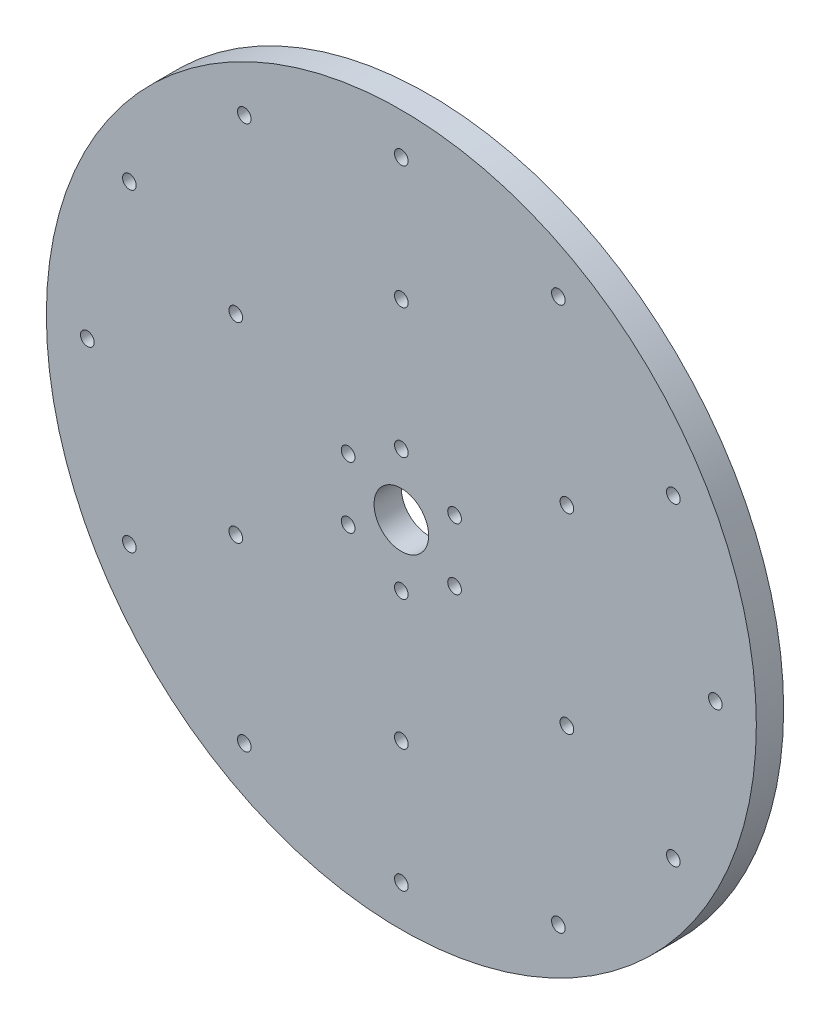
ISO-10303-21;
HEADER;
FILE_DESCRIPTION(('STEP AP214'),'2;1');
FILE_NAME('part.step','',(''),(''),'','','');
FILE_SCHEMA(('AUTOMOTIVE_DESIGN { 1 0 10303 214 1 1 1 1 }'));
ENDSEC;
DATA;
#1=APPLICATION_CONTEXT('core data for automotive mechanical design processes');
#2=APPLICATION_PROTOCOL_DEFINITION('international standard','automotive_design',2000,#1);
#3=PRODUCT_CONTEXT('',#1,'mechanical');
#4=PRODUCT('Part','Part','',(#3));
#5=PRODUCT_RELATED_PRODUCT_CATEGORY('part','',(#4));
#6=PRODUCT_DEFINITION_FORMATION('','',#4);
#7=PRODUCT_DEFINITION_CONTEXT('part definition',#1,'design');
#8=PRODUCT_DEFINITION('design','',#6,#7);
#9=PRODUCT_DEFINITION_SHAPE('','',#8);
#10=(LENGTH_UNIT() NAMED_UNIT(*) SI_UNIT(.MILLI.,.METRE.));
#11=(NAMED_UNIT(*) PLANE_ANGLE_UNIT() SI_UNIT($,.RADIAN.));
#12=(NAMED_UNIT(*) SI_UNIT($,.STERADIAN.) SOLID_ANGLE_UNIT());
#13=UNCERTAINTY_MEASURE_WITH_UNIT(LENGTH_MEASURE(1.E-05),#10,'distance_accuracy_value','');
#14=(GEOMETRIC_REPRESENTATION_CONTEXT(3) GLOBAL_UNCERTAINTY_ASSIGNED_CONTEXT((#13)) GLOBAL_UNIT_ASSIGNED_CONTEXT((#10,
#11,#12)) REPRESENTATION_CONTEXT('',''));
#15=CARTESIAN_POINT('',(0.,0.,0.));
#16=DIRECTION('',(0.,0.,1.));
#17=DIRECTION('',(1.,0.,0.));
#18=AXIS2_PLACEMENT_3D('',#15,#16,#17);
#19=CARTESIAN_POINT('',(0.,0.,10.));
#20=DIRECTION('',(0.,0.,-1.));
#21=DIRECTION('',(-1.,0.,0.));
#22=AXIS2_PLACEMENT_3D('',#19,#20,#21);
#23=CYLINDRICAL_SURFACE('',#22,130.);
#24=CARTESIAN_POINT('',(0.,0.,10.));
#25=DIRECTION('',(0.,0.,1.));
#26=DIRECTION('',(1.,0.,0.));
#27=AXIS2_PLACEMENT_3D('',#24,#25,#26);
#28=CIRCLE('',#27,130.);
#29=CARTESIAN_POINT('',(130.,0.,10.));
#30=VERTEX_POINT('',#29);
#31=EDGE_CURVE('E10',#30,#30,#28,.T.);
#32=ORIENTED_EDGE('',*,*,#31,.F.);
#33=EDGE_LOOP('',(#32));
#34=FACE_BOUND('',#33,.T.);
#35=CARTESIAN_POINT('',(0.,0.,0.));
#36=DIRECTION('',(0.,0.,1.));
#37=DIRECTION('',(1.,0.,0.));
#38=AXIS2_PLACEMENT_3D('',#35,#36,#37);
#39=CIRCLE('',#38,130.);
#40=CARTESIAN_POINT('',(130.,0.,0.));
#41=VERTEX_POINT('',#40);
#42=EDGE_CURVE('E42',#41,#41,#39,.T.);
#43=ORIENTED_EDGE('',*,*,#42,.T.);
#44=EDGE_LOOP('',(#43));
#45=FACE_BOUND('',#44,.T.);
#46=ADVANCED_FACE('F39',(#34,#45),#23,.T.);
#47=CARTESIAN_POINT('',(0.,0.,10.));
#48=DIRECTION('',(0.,0.,1.));
#49=DIRECTION('',(1.,0.,0.));
#50=AXIS2_PLACEMENT_3D('',#47,#48,#49);
#51=PLANE('',#50);
#52=CARTESIAN_POINT('',(0.,22.5,10.));
#53=DIRECTION('',(0.,0.,1.));
#54=DIRECTION('',(1.,0.,0.));
#55=AXIS2_PLACEMENT_3D('',#52,#53,#54);
#56=CIRCLE('',#55,2.5);
#57=CARTESIAN_POINT('',(2.5,22.5,10.));
#58=VERTEX_POINT('',#57);
#59=EDGE_CURVE('E190',#58,#58,#56,.T.);
#60=ORIENTED_EDGE('',*,*,#59,.F.);
#61=EDGE_LOOP('',(#60));
#62=FACE_BOUND('',#61,.T.);
#63=CARTESIAN_POINT('',(-19.4855715851499,11.25,10.));
#64=DIRECTION('',(0.,0.,1.));
#65=DIRECTION('',(1.,0.,0.));
#66=AXIS2_PLACEMENT_3D('',#63,#64,#65);
#67=CIRCLE('',#66,2.5);
#68=CARTESIAN_POINT('',(-16.9855715851499,11.25,10.));
#69=VERTEX_POINT('',#68);
#70=EDGE_CURVE('E169',#69,#69,#67,.T.);
#71=ORIENTED_EDGE('',*,*,#70,.F.);
#72=EDGE_LOOP('',(#71));
#73=FACE_BOUND('',#72,.T.);
#74=CARTESIAN_POINT('',(-19.4855715851499,-11.25,10.));
#75=DIRECTION('',(0.,0.,1.));
#76=DIRECTION('',(1.,0.,0.));
#77=AXIS2_PLACEMENT_3D('',#74,#75,#76);
#78=CIRCLE('',#77,2.5);
#79=CARTESIAN_POINT('',(-16.9855715851499,-11.25,10.));
#80=VERTEX_POINT('',#79);
#81=EDGE_CURVE('E168',#80,#80,#78,.T.);
#82=ORIENTED_EDGE('',*,*,#81,.F.);
#83=EDGE_LOOP('',(#82));
#84=FACE_BOUND('',#83,.T.);
#85=CARTESIAN_POINT('',(0.,-22.5,10.));
#86=DIRECTION('',(0.,0.,1.));
#87=DIRECTION('',(1.,0.,0.));
#88=AXIS2_PLACEMENT_3D('',#85,#86,#87);
#89=CIRCLE('',#88,2.5);
#90=CARTESIAN_POINT('',(2.5,-22.5,10.));
#91=VERTEX_POINT('',#90);
#92=EDGE_CURVE('E175',#91,#91,#89,.T.);
#93=ORIENTED_EDGE('',*,*,#92,.F.);
#94=EDGE_LOOP('',(#93));
#95=FACE_BOUND('',#94,.T.);
#96=CARTESIAN_POINT('',(19.4855715851499,-11.25,10.));
#97=DIRECTION('',(0.,0.,1.));
#98=DIRECTION('',(1.,0.,0.));
#99=AXIS2_PLACEMENT_3D('',#96,#97,#98);
#100=CIRCLE('',#99,2.5);
#101=CARTESIAN_POINT('',(21.9855715851499,-11.25,10.));
#102=VERTEX_POINT('',#101);
#103=EDGE_CURVE('E181',#102,#102,#100,.T.);
#104=ORIENTED_EDGE('',*,*,#103,.F.);
#105=EDGE_LOOP('',(#104));
#106=FACE_BOUND('',#105,.T.);
#107=CARTESIAN_POINT('',(19.4855715851499,11.25,10.));
#108=DIRECTION('',(0.,0.,1.));
#109=DIRECTION('',(1.,0.,0.));
#110=AXIS2_PLACEMENT_3D('',#107,#108,#109);
#111=CIRCLE('',#110,2.5);
#112=CARTESIAN_POINT('',(21.9855715851499,11.25,10.));
#113=VERTEX_POINT('',#112);
#114=EDGE_CURVE('E187',#113,#113,#111,.T.);
#115=ORIENTED_EDGE('',*,*,#114,.F.);
#116=EDGE_LOOP('',(#115));
#117=FACE_BOUND('',#116,.T.);
#118=CARTESIAN_POINT('',(0.,0.,10.));
#119=DIRECTION('',(0.,0.,1.));
#120=DIRECTION('',(1.,0.,0.));
#121=AXIS2_PLACEMENT_3D('',#118,#119,#120);
#122=CIRCLE('',#121,10.);
#123=CARTESIAN_POINT('',(10.,0.,10.));
#124=VERTEX_POINT('',#123);
#125=EDGE_CURVE('E159',#124,#124,#122,.T.);
#126=ORIENTED_EDGE('',*,*,#125,.F.);
#127=EDGE_LOOP('',(#126));
#128=FACE_BOUND('',#127,.T.);
#129=CARTESIAN_POINT('',(6.90853624307763E-13,115.,10.));
#130=DIRECTION('',(0.,0.,-1.));
#131=DIRECTION('',(-1.,0.,0.));
#132=AXIS2_PLACEMENT_3D('',#129,#130,#131);
#133=CIRCLE('',#132,2.50000000000003);
#134=CARTESIAN_POINT('',(-2.49999999999933,115.,10.));
#135=VERTEX_POINT('',#134);
#136=EDGE_CURVE('E57',#135,#135,#133,.T.);
#137=ORIENTED_EDGE('',*,*,#136,.T.);
#138=EDGE_LOOP('',(#137));
#139=FACE_BOUND('',#138,.T.);
#140=CARTESIAN_POINT('',(60.6217782649107,35.,10.));
#141=DIRECTION('',(0.,0.,-1.));
#142=DIRECTION('',(-1.,0.,0.));
#143=AXIS2_PLACEMENT_3D('',#140,#141,#142);
#144=CIRCLE('',#143,2.5);
#145=CARTESIAN_POINT('',(58.1217782649108,35.,10.));
#146=VERTEX_POINT('',#145);
#147=EDGE_CURVE('E96',#146,#146,#144,.T.);
#148=ORIENTED_EDGE('',*,*,#147,.T.);
#149=EDGE_LOOP('',(#148));
#150=FACE_BOUND('',#149,.T.);
#151=CARTESIAN_POINT('',(-57.4999999999994,99.5929214352108,10.));
#152=DIRECTION('',(0.,0.,-1.));
#153=DIRECTION('',(-1.,0.,0.));
#154=AXIS2_PLACEMENT_3D('',#151,#152,#153);
#155=CIRCLE('',#154,2.50000000000003);
#156=CARTESIAN_POINT('',(-59.9999999999994,99.5929214352108,10.));
#157=VERTEX_POINT('',#156);
#158=EDGE_CURVE('E89',#157,#157,#155,.T.);
#159=ORIENTED_EDGE('',*,*,#158,.T.);
#160=EDGE_LOOP('',(#159));
#161=FACE_BOUND('',#160,.T.);
#162=CARTESIAN_POINT('',(57.4999999999994,-99.5929214352108,10.));
#163=DIRECTION('',(0.,0.,-1.));
#164=DIRECTION('',(-1.,0.,0.));
#165=AXIS2_PLACEMENT_3D('',#162,#163,#164);
#166=CIRCLE('',#165,2.50000000000002);
#167=CARTESIAN_POINT('',(54.9999999999994,-99.5929214352108,10.));
#168=VERTEX_POINT('',#167);
#169=EDGE_CURVE('E108',#168,#168,#166,.T.);
#170=ORIENTED_EDGE('',*,*,#169,.T.);
#171=EDGE_LOOP('',(#170));
#172=FACE_BOUND('',#171,.T.);
#173=CARTESIAN_POINT('',(-99.5929214352101,57.5000000000006,10.));
#174=DIRECTION('',(0.,0.,-1.));
#175=DIRECTION('',(-1.,0.,0.));
#176=AXIS2_PLACEMENT_3D('',#173,#174,#175);
#177=CIRCLE('',#176,2.50000000000001);
#178=CARTESIAN_POINT('',(-102.09292143521,57.5000000000006,10.));
#179=VERTEX_POINT('',#178);
#180=EDGE_CURVE('E101',#179,#179,#177,.T.);
#181=ORIENTED_EDGE('',*,*,#180,.T.);
#182=EDGE_LOOP('',(#181));
#183=FACE_BOUND('',#182,.T.);
#184=CARTESIAN_POINT('',(60.6217782649107,-35.,10.));
#185=DIRECTION('',(0.,0.,-1.));
#186=DIRECTION('',(-1.,0.,0.));
#187=AXIS2_PLACEMENT_3D('',#184,#185,#186);
#188=CIRCLE('',#187,2.5);
#189=CARTESIAN_POINT('',(58.1217782649107,-35.,10.));
#190=VERTEX_POINT('',#189);
#191=EDGE_CURVE('E65',#190,#190,#188,.T.);
#192=ORIENTED_EDGE('',*,*,#191,.T.);
#193=EDGE_LOOP('',(#192));
#194=FACE_BOUND('',#193,.T.);
#195=CARTESIAN_POINT('',(0.,-70.,10.));
#196=DIRECTION('',(0.,0.,-1.));
#197=DIRECTION('',(-1.,0.,0.));
#198=AXIS2_PLACEMENT_3D('',#195,#196,#197);
#199=CIRCLE('',#198,2.5);
#200=CARTESIAN_POINT('',(-2.50000000000001,-70.,10.));
#201=VERTEX_POINT('',#200);
#202=EDGE_CURVE('E72',#201,#201,#199,.T.);
#203=ORIENTED_EDGE('',*,*,#202,.T.);
#204=EDGE_LOOP('',(#203));
#205=FACE_BOUND('',#204,.T.);
#206=CARTESIAN_POINT('',(-60.6217782649107,-35.,10.));
#207=DIRECTION('',(0.,0.,-1.));
#208=DIRECTION('',(-1.,0.,0.));
#209=AXIS2_PLACEMENT_3D('',#206,#207,#208);
#210=CIRCLE('',#209,2.50000000000001);
#211=CARTESIAN_POINT('',(-63.1217782649108,-35.,10.));
#212=VERTEX_POINT('',#211);
#213=EDGE_CURVE('E78',#212,#212,#210,.T.);
#214=ORIENTED_EDGE('',*,*,#213,.T.);
#215=EDGE_LOOP('',(#214));
#216=FACE_BOUND('',#215,.T.);
#217=CARTESIAN_POINT('',(-60.6217782649107,35.,10.));
#218=DIRECTION('',(0.,0.,-1.));
#219=DIRECTION('',(-1.,0.,0.));
#220=AXIS2_PLACEMENT_3D('',#217,#218,#219);
#221=CIRCLE('',#220,2.5);
#222=CARTESIAN_POINT('',(-63.1217782649107,35.,10.));
#223=VERTEX_POINT('',#222);
#224=EDGE_CURVE('E84',#223,#223,#221,.T.);
#225=ORIENTED_EDGE('',*,*,#224,.T.);
#226=EDGE_LOOP('',(#225));
#227=FACE_BOUND('',#226,.T.);
#228=CARTESIAN_POINT('',(-115.,7.18113245283428E-13,10.));
#229=DIRECTION('',(0.,0.,-1.));
#230=DIRECTION('',(-1.,0.,0.));
#231=AXIS2_PLACEMENT_3D('',#228,#229,#230);
#232=CIRCLE('',#231,2.5);
#233=CARTESIAN_POINT('',(-117.5,7.18113245283428E-13,10.));
#234=VERTEX_POINT('',#233);
#235=EDGE_CURVE('E154',#234,#234,#232,.T.);
#236=ORIENTED_EDGE('',*,*,#235,.T.);
#237=EDGE_LOOP('',(#236));
#238=FACE_BOUND('',#237,.T.);
#239=CARTESIAN_POINT('',(-99.5929214352108,-57.4999999999994,10.));
#240=DIRECTION('',(0.,0.,-1.));
#241=DIRECTION('',(-1.,0.,0.));
#242=AXIS2_PLACEMENT_3D('',#239,#240,#241);
#243=CIRCLE('',#242,2.5);
#244=CARTESIAN_POINT('',(-102.092921435211,-57.4999999999994,10.));
#245=VERTEX_POINT('',#244);
#246=EDGE_CURVE('E148',#245,#245,#243,.T.);
#247=ORIENTED_EDGE('',*,*,#246,.T.);
#248=EDGE_LOOP('',(#247));
#249=FACE_BOUND('',#248,.T.);
#250=CARTESIAN_POINT('',(-57.5000000000006,-99.5929214352101,10.));
#251=DIRECTION('',(0.,0.,-1.));
#252=DIRECTION('',(-1.,0.,0.));
#253=AXIS2_PLACEMENT_3D('',#250,#251,#252);
#254=CIRCLE('',#253,2.50000000000002);
#255=CARTESIAN_POINT('',(-60.0000000000007,-99.5929214352101,10.));
#256=VERTEX_POINT('',#255);
#257=EDGE_CURVE('E142',#256,#256,#254,.T.);
#258=ORIENTED_EDGE('',*,*,#257,.T.);
#259=EDGE_LOOP('',(#258));
#260=FACE_BOUND('',#259,.T.);
#261=CARTESIAN_POINT('',(-7.44567778292074E-13,-115.,10.));
#262=DIRECTION('',(0.,0.,-1.));
#263=DIRECTION('',(-1.,0.,0.));
#264=AXIS2_PLACEMENT_3D('',#261,#262,#263);
#265=CIRCLE('',#264,2.5);
#266=CARTESIAN_POINT('',(-2.50000000000074,-115.,10.));
#267=VERTEX_POINT('',#266);
#268=EDGE_CURVE('E136',#267,#267,#265,.T.);
#269=ORIENTED_EDGE('',*,*,#268,.T.);
#270=EDGE_LOOP('',(#269));
#271=FACE_BOUND('',#270,.T.);
#272=CARTESIAN_POINT('',(99.5929214352101,-57.5000000000006,10.));
#273=DIRECTION('',(0.,0.,-1.));
#274=DIRECTION('',(-1.,0.,0.));
#275=AXIS2_PLACEMENT_3D('',#272,#273,#274);
#276=CIRCLE('',#275,2.5);
#277=CARTESIAN_POINT('',(97.0929214352101,-57.5000000000006,10.));
#278=VERTEX_POINT('',#277);
#279=EDGE_CURVE('E130',#278,#278,#276,.T.);
#280=ORIENTED_EDGE('',*,*,#279,.T.);
#281=EDGE_LOOP('',(#280));
#282=FACE_BOUND('',#281,.T.);
#283=CARTESIAN_POINT('',(115.,-7.58011885230894E-13,10.));
#284=DIRECTION('',(0.,0.,-1.));
#285=DIRECTION('',(-1.,0.,0.));
#286=AXIS2_PLACEMENT_3D('',#283,#284,#285);
#287=CIRCLE('',#286,2.50000000000002);
#288=CARTESIAN_POINT('',(112.5,-7.58011885230894E-13,10.));
#289=VERTEX_POINT('',#288);
#290=EDGE_CURVE('E124',#289,#289,#287,.T.);
#291=ORIENTED_EDGE('',*,*,#290,.T.);
#292=EDGE_LOOP('',(#291));
#293=FACE_BOUND('',#292,.T.);
#294=CARTESIAN_POINT('',(99.5929214352108,57.4999999999994,10.));
#295=DIRECTION('',(0.,0.,-1.));
#296=DIRECTION('',(-1.,0.,0.));
#297=AXIS2_PLACEMENT_3D('',#294,#295,#296);
#298=CIRCLE('',#297,2.50000000000002);
#299=CARTESIAN_POINT('',(97.0929214352108,57.4999999999994,10.));
#300=VERTEX_POINT('',#299);
#301=EDGE_CURVE('E118',#300,#300,#298,.T.);
#302=ORIENTED_EDGE('',*,*,#301,.T.);
#303=EDGE_LOOP('',(#302));
#304=FACE_BOUND('',#303,.T.);
#305=CARTESIAN_POINT('',(57.5000000000007,99.5929214352101,10.));
#306=DIRECTION('',(0.,0.,-1.));
#307=DIRECTION('',(-1.,0.,0.));
#308=AXIS2_PLACEMENT_3D('',#305,#306,#307);
#309=CIRCLE('',#308,2.50000000000004);
#310=CARTESIAN_POINT('',(55.0000000000007,99.5929214352101,10.));
#311=VERTEX_POINT('',#310);
#312=EDGE_CURVE('E64',#311,#311,#309,.T.);
#313=ORIENTED_EDGE('',*,*,#312,.T.);
#314=EDGE_LOOP('',(#313));
#315=FACE_BOUND('',#314,.T.);
#316=CARTESIAN_POINT('',(0.,70.,10.));
#317=DIRECTION('',(0.,0.,-1.));
#318=DIRECTION('',(-1.,0.,0.));
#319=AXIS2_PLACEMENT_3D('',#316,#317,#318);
#320=CIRCLE('',#319,2.5);
#321=CARTESIAN_POINT('',(-2.5,70.,10.));
#322=VERTEX_POINT('',#321);
#323=EDGE_CURVE('E49',#322,#322,#320,.T.);
#324=ORIENTED_EDGE('',*,*,#323,.T.);
#325=EDGE_LOOP('',(#324));
#326=FACE_BOUND('',#325,.T.);
#327=ORIENTED_EDGE('',*,*,#31,.T.);
#328=EDGE_LOOP('',(#327));
#329=FACE_BOUND('',#328,.T.);
#330=ADVANCED_FACE('F211',(#62,#73,#84,#95,#106,#117,#128,#139,#150,#161,#172,#183,#194,#205,
#216,#227,#238,#249,#260,#271,#282,#293,#304,#315,#326,#329),#51,.T.);
#331=CARTESIAN_POINT('',(0.,0.,0.));
#332=DIRECTION('',(0.,0.,1.));
#333=DIRECTION('',(1.,0.,0.));
#334=AXIS2_PLACEMENT_3D('',#331,#332,#333);
#335=PLANE('',#334);
#336=CARTESIAN_POINT('',(0.,22.5,0.));
#337=DIRECTION('',(0.,0.,1.));
#338=DIRECTION('',(1.,0.,0.));
#339=AXIS2_PLACEMENT_3D('',#336,#337,#338);
#340=CIRCLE('',#339,2.5);
#341=CARTESIAN_POINT('',(2.5,22.5,0.));
#342=VERTEX_POINT('',#341);
#343=EDGE_CURVE('E162',#342,#342,#340,.T.);
#344=ORIENTED_EDGE('',*,*,#343,.T.);
#345=EDGE_LOOP('',(#344));
#346=FACE_BOUND('',#345,.T.);
#347=CARTESIAN_POINT('',(-19.4855715851499,11.25,0.));
#348=DIRECTION('',(0.,0.,1.));
#349=DIRECTION('',(1.,0.,0.));
#350=AXIS2_PLACEMENT_3D('',#347,#348,#349);
#351=CIRCLE('',#350,2.5);
#352=CARTESIAN_POINT('',(-16.9855715851499,11.25,0.));
#353=VERTEX_POINT('',#352);
#354=EDGE_CURVE('E191',#353,#353,#351,.T.);
#355=ORIENTED_EDGE('',*,*,#354,.T.);
#356=EDGE_LOOP('',(#355));
#357=FACE_BOUND('',#356,.T.);
#358=CARTESIAN_POINT('',(-19.4855715851499,-11.25,0.));
#359=DIRECTION('',(0.,0.,1.));
#360=DIRECTION('',(1.,0.,0.));
#361=AXIS2_PLACEMENT_3D('',#358,#359,#360);
#362=CIRCLE('',#361,2.5);
#363=CARTESIAN_POINT('',(-16.9855715851499,-11.25,0.));
#364=VERTEX_POINT('',#363);
#365=EDGE_CURVE('E165',#364,#364,#362,.T.);
#366=ORIENTED_EDGE('',*,*,#365,.T.);
#367=EDGE_LOOP('',(#366));
#368=FACE_BOUND('',#367,.T.);
#369=CARTESIAN_POINT('',(0.,-22.5,0.));
#370=DIRECTION('',(0.,0.,1.));
#371=DIRECTION('',(1.,0.,0.));
#372=AXIS2_PLACEMENT_3D('',#369,#370,#371);
#373=CIRCLE('',#372,2.5);
#374=CARTESIAN_POINT('',(2.5,-22.5,0.));
#375=VERTEX_POINT('',#374);
#376=EDGE_CURVE('E172',#375,#375,#373,.T.);
#377=ORIENTED_EDGE('',*,*,#376,.T.);
#378=EDGE_LOOP('',(#377));
#379=FACE_BOUND('',#378,.T.);
#380=CARTESIAN_POINT('',(19.4855715851499,-11.25,0.));
#381=DIRECTION('',(0.,0.,1.));
#382=DIRECTION('',(1.,0.,0.));
#383=AXIS2_PLACEMENT_3D('',#380,#381,#382);
#384=CIRCLE('',#383,2.5);
#385=CARTESIAN_POINT('',(21.9855715851499,-11.25,0.));
#386=VERTEX_POINT('',#385);
#387=EDGE_CURVE('E178',#386,#386,#384,.T.);
#388=ORIENTED_EDGE('',*,*,#387,.T.);
#389=EDGE_LOOP('',(#388));
#390=FACE_BOUND('',#389,.T.);
#391=CARTESIAN_POINT('',(19.4855715851499,11.25,0.));
#392=DIRECTION('',(0.,0.,1.));
#393=DIRECTION('',(1.,0.,0.));
#394=AXIS2_PLACEMENT_3D('',#391,#392,#393);
#395=CIRCLE('',#394,2.5);
#396=CARTESIAN_POINT('',(21.9855715851499,11.25,0.));
#397=VERTEX_POINT('',#396);
#398=EDGE_CURVE('E184',#397,#397,#395,.T.);
#399=ORIENTED_EDGE('',*,*,#398,.T.);
#400=EDGE_LOOP('',(#399));
#401=FACE_BOUND('',#400,.T.);
#402=CARTESIAN_POINT('',(0.,0.,0.));
#403=DIRECTION('',(0.,0.,1.));
#404=DIRECTION('',(1.,0.,0.));
#405=AXIS2_PLACEMENT_3D('',#402,#403,#404);
#406=CIRCLE('',#405,10.);
#407=CARTESIAN_POINT('',(10.,0.,0.));
#408=VERTEX_POINT('',#407);
#409=EDGE_CURVE('E61',#408,#408,#406,.T.);
#410=ORIENTED_EDGE('',*,*,#409,.T.);
#411=EDGE_LOOP('',(#410));
#412=FACE_BOUND('',#411,.T.);
#413=CARTESIAN_POINT('',(6.90853624307763E-13,115.,0.));
#414=DIRECTION('',(0.,0.,-1.));
#415=DIRECTION('',(-1.,0.,0.));
#416=AXIS2_PLACEMENT_3D('',#413,#414,#415);
#417=CIRCLE('',#416,2.50000000000003);
#418=CARTESIAN_POINT('',(-2.49999999999933,115.,0.));
#419=VERTEX_POINT('',#418);
#420=EDGE_CURVE('E60',#419,#419,#417,.T.);
#421=ORIENTED_EDGE('',*,*,#420,.F.);
#422=EDGE_LOOP('',(#421));
#423=FACE_BOUND('',#422,.T.);
#424=CARTESIAN_POINT('',(60.6217782649107,35.,0.));
#425=DIRECTION('',(0.,0.,-1.));
#426=DIRECTION('',(-1.,0.,0.));
#427=AXIS2_PLACEMENT_3D('',#424,#425,#426);
#428=CIRCLE('',#427,2.5);
#429=CARTESIAN_POINT('',(58.1217782649108,35.,0.));
#430=VERTEX_POINT('',#429);
#431=EDGE_CURVE('E69',#430,#430,#428,.T.);
#432=ORIENTED_EDGE('',*,*,#431,.F.);
#433=EDGE_LOOP('',(#432));
#434=FACE_BOUND('',#433,.T.);
#435=CARTESIAN_POINT('',(-57.4999999999994,99.5929214352108,0.));
#436=DIRECTION('',(0.,0.,-1.));
#437=DIRECTION('',(-1.,0.,0.));
#438=AXIS2_PLACEMENT_3D('',#435,#436,#437);
#439=CIRCLE('',#438,2.50000000000003);
#440=CARTESIAN_POINT('',(-59.9999999999994,99.5929214352108,0.));
#441=VERTEX_POINT('',#440);
#442=EDGE_CURVE('E92',#441,#441,#439,.T.);
#443=ORIENTED_EDGE('',*,*,#442,.F.);
#444=EDGE_LOOP('',(#443));
#445=FACE_BOUND('',#444,.T.);
#446=CARTESIAN_POINT('',(57.4999999999994,-99.5929214352108,0.));
#447=DIRECTION('',(0.,0.,-1.));
#448=DIRECTION('',(-1.,0.,0.));
#449=AXIS2_PLACEMENT_3D('',#446,#447,#448);
#450=CIRCLE('',#449,2.50000000000002);
#451=CARTESIAN_POINT('',(54.9999999999994,-99.5929214352108,0.));
#452=VERTEX_POINT('',#451);
#453=EDGE_CURVE('E93',#452,#452,#450,.T.);
#454=ORIENTED_EDGE('',*,*,#453,.F.);
#455=EDGE_LOOP('',(#454));
#456=FACE_BOUND('',#455,.T.);
#457=CARTESIAN_POINT('',(-99.5929214352101,57.5000000000006,0.));
#458=DIRECTION('',(0.,0.,-1.));
#459=DIRECTION('',(-1.,0.,0.));
#460=AXIS2_PLACEMENT_3D('',#457,#458,#459);
#461=CIRCLE('',#460,2.50000000000001);
#462=CARTESIAN_POINT('',(-102.09292143521,57.5000000000006,0.));
#463=VERTEX_POINT('',#462);
#464=EDGE_CURVE('E104',#463,#463,#461,.T.);
#465=ORIENTED_EDGE('',*,*,#464,.F.);
#466=EDGE_LOOP('',(#465));
#467=FACE_BOUND('',#466,.T.);
#468=CARTESIAN_POINT('',(60.6217782649107,-35.,0.));
#469=DIRECTION('',(0.,0.,-1.));
#470=DIRECTION('',(-1.,0.,0.));
#471=AXIS2_PLACEMENT_3D('',#468,#469,#470);
#472=CIRCLE('',#471,2.5);
#473=CARTESIAN_POINT('',(58.1217782649107,-35.,0.));
#474=VERTEX_POINT('',#473);
#475=EDGE_CURVE('E68',#474,#474,#472,.T.);
#476=ORIENTED_EDGE('',*,*,#475,.F.);
#477=EDGE_LOOP('',(#476));
#478=FACE_BOUND('',#477,.T.);
#479=CARTESIAN_POINT('',(0.,-70.,0.));
#480=DIRECTION('',(0.,0.,-1.));
#481=DIRECTION('',(-1.,0.,0.));
#482=AXIS2_PLACEMENT_3D('',#479,#480,#481);
#483=CIRCLE('',#482,2.5);
#484=CARTESIAN_POINT('',(-2.50000000000001,-70.,0.));
#485=VERTEX_POINT('',#484);
#486=EDGE_CURVE('E75',#485,#485,#483,.T.);
#487=ORIENTED_EDGE('',*,*,#486,.F.);
#488=EDGE_LOOP('',(#487));
#489=FACE_BOUND('',#488,.T.);
#490=CARTESIAN_POINT('',(-60.6217782649107,-35.,0.));
#491=DIRECTION('',(0.,0.,-1.));
#492=DIRECTION('',(-1.,0.,0.));
#493=AXIS2_PLACEMENT_3D('',#490,#491,#492);
#494=CIRCLE('',#493,2.50000000000001);
#495=CARTESIAN_POINT('',(-63.1217782649108,-35.,0.));
#496=VERTEX_POINT('',#495);
#497=EDGE_CURVE('E81',#496,#496,#494,.T.);
#498=ORIENTED_EDGE('',*,*,#497,.F.);
#499=EDGE_LOOP('',(#498));
#500=FACE_BOUND('',#499,.T.);
#501=CARTESIAN_POINT('',(-60.6217782649107,35.,0.));
#502=DIRECTION('',(0.,0.,-1.));
#503=DIRECTION('',(-1.,0.,0.));
#504=AXIS2_PLACEMENT_3D('',#501,#502,#503);
#505=CIRCLE('',#504,2.5);
#506=CARTESIAN_POINT('',(-63.1217782649107,35.,0.));
#507=VERTEX_POINT('',#506);
#508=EDGE_CURVE('E54',#507,#507,#505,.T.);
#509=ORIENTED_EDGE('',*,*,#508,.F.);
#510=EDGE_LOOP('',(#509));
#511=FACE_BOUND('',#510,.T.);
#512=CARTESIAN_POINT('',(-115.,7.18113245283428E-13,0.));
#513=DIRECTION('',(0.,0.,-1.));
#514=DIRECTION('',(-1.,0.,0.));
#515=AXIS2_PLACEMENT_3D('',#512,#513,#514);
#516=CIRCLE('',#515,2.5);
#517=CARTESIAN_POINT('',(-117.5,7.18113245283428E-13,0.));
#518=VERTEX_POINT('',#517);
#519=EDGE_CURVE('E105',#518,#518,#516,.T.);
#520=ORIENTED_EDGE('',*,*,#519,.F.);
#521=EDGE_LOOP('',(#520));
#522=FACE_BOUND('',#521,.T.);
#523=CARTESIAN_POINT('',(-99.5929214352108,-57.4999999999994,0.));
#524=DIRECTION('',(0.,0.,-1.));
#525=DIRECTION('',(-1.,0.,0.));
#526=AXIS2_PLACEMENT_3D('',#523,#524,#525);
#527=CIRCLE('',#526,2.5);
#528=CARTESIAN_POINT('',(-102.092921435211,-57.4999999999994,0.));
#529=VERTEX_POINT('',#528);
#530=EDGE_CURVE('E151',#529,#529,#527,.T.);
#531=ORIENTED_EDGE('',*,*,#530,.F.);
#532=EDGE_LOOP('',(#531));
#533=FACE_BOUND('',#532,.T.);
#534=CARTESIAN_POINT('',(-57.5000000000006,-99.5929214352101,0.));
#535=DIRECTION('',(0.,0.,-1.));
#536=DIRECTION('',(-1.,0.,0.));
#537=AXIS2_PLACEMENT_3D('',#534,#535,#536);
#538=CIRCLE('',#537,2.50000000000002);
#539=CARTESIAN_POINT('',(-60.0000000000007,-99.5929214352101,0.));
#540=VERTEX_POINT('',#539);
#541=EDGE_CURVE('E145',#540,#540,#538,.T.);
#542=ORIENTED_EDGE('',*,*,#541,.F.);
#543=EDGE_LOOP('',(#542));
#544=FACE_BOUND('',#543,.T.);
#545=CARTESIAN_POINT('',(-7.44567778292074E-13,-115.,0.));
#546=DIRECTION('',(0.,0.,-1.));
#547=DIRECTION('',(-1.,0.,0.));
#548=AXIS2_PLACEMENT_3D('',#545,#546,#547);
#549=CIRCLE('',#548,2.5);
#550=CARTESIAN_POINT('',(-2.50000000000074,-115.,0.));
#551=VERTEX_POINT('',#550);
#552=EDGE_CURVE('E139',#551,#551,#549,.T.);
#553=ORIENTED_EDGE('',*,*,#552,.F.);
#554=EDGE_LOOP('',(#553));
#555=FACE_BOUND('',#554,.T.);
#556=CARTESIAN_POINT('',(99.5929214352101,-57.5000000000006,0.));
#557=DIRECTION('',(0.,0.,-1.));
#558=DIRECTION('',(-1.,0.,0.));
#559=AXIS2_PLACEMENT_3D('',#556,#557,#558);
#560=CIRCLE('',#559,2.5);
#561=CARTESIAN_POINT('',(97.0929214352101,-57.5000000000006,0.));
#562=VERTEX_POINT('',#561);
#563=EDGE_CURVE('E133',#562,#562,#560,.T.);
#564=ORIENTED_EDGE('',*,*,#563,.F.);
#565=EDGE_LOOP('',(#564));
#566=FACE_BOUND('',#565,.T.);
#567=CARTESIAN_POINT('',(115.,-7.58011885230894E-13,0.));
#568=DIRECTION('',(0.,0.,-1.));
#569=DIRECTION('',(-1.,0.,0.));
#570=AXIS2_PLACEMENT_3D('',#567,#568,#569);
#571=CIRCLE('',#570,2.50000000000002);
#572=CARTESIAN_POINT('',(112.5,-7.58011885230894E-13,0.));
#573=VERTEX_POINT('',#572);
#574=EDGE_CURVE('E127',#573,#573,#571,.T.);
#575=ORIENTED_EDGE('',*,*,#574,.F.);
#576=EDGE_LOOP('',(#575));
#577=FACE_BOUND('',#576,.T.);
#578=CARTESIAN_POINT('',(99.5929214352108,57.4999999999994,0.));
#579=DIRECTION('',(0.,0.,-1.));
#580=DIRECTION('',(-1.,0.,0.));
#581=AXIS2_PLACEMENT_3D('',#578,#579,#580);
#582=CIRCLE('',#581,2.50000000000002);
#583=CARTESIAN_POINT('',(97.0929214352108,57.4999999999994,0.));
#584=VERTEX_POINT('',#583);
#585=EDGE_CURVE('E121',#584,#584,#582,.T.);
#586=ORIENTED_EDGE('',*,*,#585,.F.);
#587=EDGE_LOOP('',(#586));
#588=FACE_BOUND('',#587,.T.);
#589=CARTESIAN_POINT('',(57.5000000000007,99.5929214352101,0.));
#590=DIRECTION('',(0.,0.,-1.));
#591=DIRECTION('',(-1.,0.,0.));
#592=AXIS2_PLACEMENT_3D('',#589,#590,#591);
#593=CIRCLE('',#592,2.50000000000004);
#594=CARTESIAN_POINT('',(55.0000000000007,99.5929214352101,0.));
#595=VERTEX_POINT('',#594);
#596=EDGE_CURVE('E115',#595,#595,#593,.T.);
#597=ORIENTED_EDGE('',*,*,#596,.F.);
#598=EDGE_LOOP('',(#597));
#599=FACE_BOUND('',#598,.T.);
#600=CARTESIAN_POINT('',(0.,70.,0.));
#601=DIRECTION('',(0.,0.,-1.));
#602=DIRECTION('',(-1.,0.,0.));
#603=AXIS2_PLACEMENT_3D('',#600,#601,#602);
#604=CIRCLE('',#603,2.5);
#605=CARTESIAN_POINT('',(-2.5,70.,0.));
#606=VERTEX_POINT('',#605);
#607=EDGE_CURVE('E51',#606,#606,#604,.T.);
#608=ORIENTED_EDGE('',*,*,#607,.F.);
#609=EDGE_LOOP('',(#608));
#610=FACE_BOUND('',#609,.T.);
#611=ORIENTED_EDGE('',*,*,#42,.F.);
#612=EDGE_LOOP('',(#611));
#613=FACE_BOUND('',#612,.T.);
#614=ADVANCED_FACE('F201',(#346,#357,#368,#379,#390,#401,#412,#423,#434,#445,#456,#467,#478,
#489,#500,#511,#522,#533,#544,#555,#566,#577,#588,#599,#610,#613),#335,.F.);
#615=CARTESIAN_POINT('',(0.,70.,10.));
#616=DIRECTION('',(0.,0.,-1.));
#617=DIRECTION('',(-1.,0.,0.));
#618=AXIS2_PLACEMENT_3D('',#615,#616,#617);
#619=CYLINDRICAL_SURFACE('',#618,2.5);
#620=ORIENTED_EDGE('',*,*,#323,.F.);
#621=EDGE_LOOP('',(#620));
#622=FACE_BOUND('',#621,.T.);
#623=ORIENTED_EDGE('',*,*,#607,.T.);
#624=EDGE_LOOP('',(#623));
#625=FACE_BOUND('',#624,.T.);
#626=ADVANCED_FACE('F263',(#622,#625),#619,.F.);
#627=CARTESIAN_POINT('',(57.5000000000007,99.5929214352101,10.));
#628=DIRECTION('',(0.,0.,-1.));
#629=DIRECTION('',(-1.,0.,0.));
#630=AXIS2_PLACEMENT_3D('',#627,#628,#629);
#631=CYLINDRICAL_SURFACE('',#630,2.50000000000004);
#632=ORIENTED_EDGE('',*,*,#312,.F.);
#633=EDGE_LOOP('',(#632));
#634=FACE_BOUND('',#633,.T.);
#635=ORIENTED_EDGE('',*,*,#596,.T.);
#636=EDGE_LOOP('',(#635));
#637=FACE_BOUND('',#636,.T.);
#638=ADVANCED_FACE('F266',(#634,#637),#631,.F.);
#639=CARTESIAN_POINT('',(99.5929214352108,57.4999999999994,10.));
#640=DIRECTION('',(0.,0.,-1.));
#641=DIRECTION('',(-1.,0.,0.));
#642=AXIS2_PLACEMENT_3D('',#639,#640,#641);
#643=CYLINDRICAL_SURFACE('',#642,2.50000000000002);
#644=ORIENTED_EDGE('',*,*,#301,.F.);
#645=EDGE_LOOP('',(#644));
#646=FACE_BOUND('',#645,.T.);
#647=ORIENTED_EDGE('',*,*,#585,.T.);
#648=EDGE_LOOP('',(#647));
#649=FACE_BOUND('',#648,.T.);
#650=ADVANCED_FACE('F292',(#646,#649),#643,.F.);
#651=CARTESIAN_POINT('',(115.,-7.58011885230894E-13,10.));
#652=DIRECTION('',(0.,0.,-1.));
#653=DIRECTION('',(-1.,0.,0.));
#654=AXIS2_PLACEMENT_3D('',#651,#652,#653);
#655=CYLINDRICAL_SURFACE('',#654,2.50000000000002);
#656=ORIENTED_EDGE('',*,*,#290,.F.);
#657=EDGE_LOOP('',(#656));
#658=FACE_BOUND('',#657,.T.);
#659=ORIENTED_EDGE('',*,*,#574,.T.);
#660=EDGE_LOOP('',(#659));
#661=FACE_BOUND('',#660,.T.);
#662=ADVANCED_FACE('F301',(#658,#661),#655,.F.);
#663=CARTESIAN_POINT('',(99.5929214352101,-57.5000000000006,10.));
#664=DIRECTION('',(0.,0.,-1.));
#665=DIRECTION('',(-1.,0.,0.));
#666=AXIS2_PLACEMENT_3D('',#663,#664,#665);
#667=CYLINDRICAL_SURFACE('',#666,2.5);
#668=ORIENTED_EDGE('',*,*,#279,.F.);
#669=EDGE_LOOP('',(#668));
#670=FACE_BOUND('',#669,.T.);
#671=ORIENTED_EDGE('',*,*,#563,.T.);
#672=EDGE_LOOP('',(#671));
#673=FACE_BOUND('',#672,.T.);
#674=ADVANCED_FACE('F310',(#670,#673),#667,.F.);
#675=CARTESIAN_POINT('',(-7.44567778292074E-13,-115.,10.));
#676=DIRECTION('',(0.,0.,-1.));
#677=DIRECTION('',(-1.,0.,0.));
#678=AXIS2_PLACEMENT_3D('',#675,#676,#677);
#679=CYLINDRICAL_SURFACE('',#678,2.5);
#680=ORIENTED_EDGE('',*,*,#268,.F.);
#681=EDGE_LOOP('',(#680));
#682=FACE_BOUND('',#681,.T.);
#683=ORIENTED_EDGE('',*,*,#552,.T.);
#684=EDGE_LOOP('',(#683));
#685=FACE_BOUND('',#684,.T.);
#686=ADVANCED_FACE('F319',(#682,#685),#679,.F.);
#687=CARTESIAN_POINT('',(-57.5000000000006,-99.5929214352101,10.));
#688=DIRECTION('',(0.,0.,-1.));
#689=DIRECTION('',(-1.,0.,0.));
#690=AXIS2_PLACEMENT_3D('',#687,#688,#689);
#691=CYLINDRICAL_SURFACE('',#690,2.50000000000002);
#692=ORIENTED_EDGE('',*,*,#257,.F.);
#693=EDGE_LOOP('',(#692));
#694=FACE_BOUND('',#693,.T.);
#695=ORIENTED_EDGE('',*,*,#541,.T.);
#696=EDGE_LOOP('',(#695));
#697=FACE_BOUND('',#696,.T.);
#698=ADVANCED_FACE('F328',(#694,#697),#691,.F.);
#699=CARTESIAN_POINT('',(-99.5929214352108,-57.4999999999994,10.));
#700=DIRECTION('',(0.,0.,-1.));
#701=DIRECTION('',(-1.,0.,0.));
#702=AXIS2_PLACEMENT_3D('',#699,#700,#701);
#703=CYLINDRICAL_SURFACE('',#702,2.5);
#704=ORIENTED_EDGE('',*,*,#246,.F.);
#705=EDGE_LOOP('',(#704));
#706=FACE_BOUND('',#705,.T.);
#707=ORIENTED_EDGE('',*,*,#530,.T.);
#708=EDGE_LOOP('',(#707));
#709=FACE_BOUND('',#708,.T.);
#710=ADVANCED_FACE('F337',(#706,#709),#703,.F.);
#711=CARTESIAN_POINT('',(-115.,7.18113245283428E-13,10.));
#712=DIRECTION('',(0.,0.,-1.));
#713=DIRECTION('',(-1.,0.,0.));
#714=AXIS2_PLACEMENT_3D('',#711,#712,#713);
#715=CYLINDRICAL_SURFACE('',#714,2.5);
#716=ORIENTED_EDGE('',*,*,#235,.F.);
#717=EDGE_LOOP('',(#716));
#718=FACE_BOUND('',#717,.T.);
#719=ORIENTED_EDGE('',*,*,#519,.T.);
#720=EDGE_LOOP('',(#719));
#721=FACE_BOUND('',#720,.T.);
#722=ADVANCED_FACE('F346',(#718,#721),#715,.F.);
#723=CARTESIAN_POINT('',(-60.6217782649107,35.,10.));
#724=DIRECTION('',(0.,0.,-1.));
#725=DIRECTION('',(-1.,0.,0.));
#726=AXIS2_PLACEMENT_3D('',#723,#724,#725);
#727=CYLINDRICAL_SURFACE('',#726,2.5);
#728=ORIENTED_EDGE('',*,*,#224,.F.);
#729=EDGE_LOOP('',(#728));
#730=FACE_BOUND('',#729,.T.);
#731=ORIENTED_EDGE('',*,*,#508,.T.);
#732=EDGE_LOOP('',(#731));
#733=FACE_BOUND('',#732,.T.);
#734=ADVANCED_FACE('F355',(#730,#733),#727,.F.);
#735=CARTESIAN_POINT('',(-60.6217782649107,-35.,10.));
#736=DIRECTION('',(0.,0.,-1.));
#737=DIRECTION('',(-1.,0.,0.));
#738=AXIS2_PLACEMENT_3D('',#735,#736,#737);
#739=CYLINDRICAL_SURFACE('',#738,2.50000000000001);
#740=ORIENTED_EDGE('',*,*,#213,.F.);
#741=EDGE_LOOP('',(#740));
#742=FACE_BOUND('',#741,.T.);
#743=ORIENTED_EDGE('',*,*,#497,.T.);
#744=EDGE_LOOP('',(#743));
#745=FACE_BOUND('',#744,.T.);
#746=ADVANCED_FACE('F364',(#742,#745),#739,.F.);
#747=CARTESIAN_POINT('',(0.,-70.,10.));
#748=DIRECTION('',(0.,0.,-1.));
#749=DIRECTION('',(-1.,0.,0.));
#750=AXIS2_PLACEMENT_3D('',#747,#748,#749);
#751=CYLINDRICAL_SURFACE('',#750,2.5);
#752=ORIENTED_EDGE('',*,*,#202,.F.);
#753=EDGE_LOOP('',(#752));
#754=FACE_BOUND('',#753,.T.);
#755=ORIENTED_EDGE('',*,*,#486,.T.);
#756=EDGE_LOOP('',(#755));
#757=FACE_BOUND('',#756,.T.);
#758=ADVANCED_FACE('F373',(#754,#757),#751,.F.);
#759=CARTESIAN_POINT('',(60.6217782649107,-35.,10.));
#760=DIRECTION('',(0.,0.,-1.));
#761=DIRECTION('',(-1.,0.,0.));
#762=AXIS2_PLACEMENT_3D('',#759,#760,#761);
#763=CYLINDRICAL_SURFACE('',#762,2.5);
#764=ORIENTED_EDGE('',*,*,#191,.F.);
#765=EDGE_LOOP('',(#764));
#766=FACE_BOUND('',#765,.T.);
#767=ORIENTED_EDGE('',*,*,#475,.T.);
#768=EDGE_LOOP('',(#767));
#769=FACE_BOUND('',#768,.T.);
#770=ADVANCED_FACE('F382',(#766,#769),#763,.F.);
#771=CARTESIAN_POINT('',(-99.5929214352101,57.5000000000006,10.));
#772=DIRECTION('',(0.,0.,-1.));
#773=DIRECTION('',(-1.,0.,0.));
#774=AXIS2_PLACEMENT_3D('',#771,#772,#773);
#775=CYLINDRICAL_SURFACE('',#774,2.50000000000001);
#776=ORIENTED_EDGE('',*,*,#180,.F.);
#777=EDGE_LOOP('',(#776));
#778=FACE_BOUND('',#777,.T.);
#779=ORIENTED_EDGE('',*,*,#464,.T.);
#780=EDGE_LOOP('',(#779));
#781=FACE_BOUND('',#780,.T.);
#782=ADVANCED_FACE('F391',(#778,#781),#775,.F.);
#783=CARTESIAN_POINT('',(57.4999999999994,-99.5929214352108,10.));
#784=DIRECTION('',(0.,0.,-1.));
#785=DIRECTION('',(-1.,0.,0.));
#786=AXIS2_PLACEMENT_3D('',#783,#784,#785);
#787=CYLINDRICAL_SURFACE('',#786,2.50000000000002);
#788=ORIENTED_EDGE('',*,*,#169,.F.);
#789=EDGE_LOOP('',(#788));
#790=FACE_BOUND('',#789,.T.);
#791=ORIENTED_EDGE('',*,*,#453,.T.);
#792=EDGE_LOOP('',(#791));
#793=FACE_BOUND('',#792,.T.);
#794=ADVANCED_FACE('F400',(#790,#793),#787,.F.);
#795=CARTESIAN_POINT('',(-57.4999999999994,99.5929214352108,10.));
#796=DIRECTION('',(0.,0.,-1.));
#797=DIRECTION('',(-1.,0.,0.));
#798=AXIS2_PLACEMENT_3D('',#795,#796,#797);
#799=CYLINDRICAL_SURFACE('',#798,2.50000000000003);
#800=ORIENTED_EDGE('',*,*,#158,.F.);
#801=EDGE_LOOP('',(#800));
#802=FACE_BOUND('',#801,.T.);
#803=ORIENTED_EDGE('',*,*,#442,.T.);
#804=EDGE_LOOP('',(#803));
#805=FACE_BOUND('',#804,.T.);
#806=ADVANCED_FACE('F409',(#802,#805),#799,.F.);
#807=CARTESIAN_POINT('',(60.6217782649107,35.,10.));
#808=DIRECTION('',(0.,0.,-1.));
#809=DIRECTION('',(-1.,0.,0.));
#810=AXIS2_PLACEMENT_3D('',#807,#808,#809);
#811=CYLINDRICAL_SURFACE('',#810,2.5);
#812=ORIENTED_EDGE('',*,*,#147,.F.);
#813=EDGE_LOOP('',(#812));
#814=FACE_BOUND('',#813,.T.);
#815=ORIENTED_EDGE('',*,*,#431,.T.);
#816=EDGE_LOOP('',(#815));
#817=FACE_BOUND('',#816,.T.);
#818=ADVANCED_FACE('F418',(#814,#817),#811,.F.);
#819=CARTESIAN_POINT('',(6.90853624307763E-13,115.,10.));
#820=DIRECTION('',(0.,0.,-1.));
#821=DIRECTION('',(-1.,0.,0.));
#822=AXIS2_PLACEMENT_3D('',#819,#820,#821);
#823=CYLINDRICAL_SURFACE('',#822,2.50000000000003);
#824=ORIENTED_EDGE('',*,*,#136,.F.);
#825=EDGE_LOOP('',(#824));
#826=FACE_BOUND('',#825,.T.);
#827=ORIENTED_EDGE('',*,*,#420,.T.);
#828=EDGE_LOOP('',(#827));
#829=FACE_BOUND('',#828,.T.);
#830=ADVANCED_FACE('F427',(#826,#829),#823,.F.);
#831=CARTESIAN_POINT('',(0.,0.,0.));
#832=DIRECTION('',(0.,0.,1.));
#833=DIRECTION('',(1.,0.,0.));
#834=AXIS2_PLACEMENT_3D('',#831,#832,#833);
#835=CYLINDRICAL_SURFACE('',#834,10.);
#836=ORIENTED_EDGE('',*,*,#409,.F.);
#837=EDGE_LOOP('',(#836));
#838=FACE_BOUND('',#837,.T.);
#839=ORIENTED_EDGE('',*,*,#125,.T.);
#840=EDGE_LOOP('',(#839));
#841=FACE_BOUND('',#840,.T.);
#842=ADVANCED_FACE('F436',(#838,#841),#835,.F.);
#843=CARTESIAN_POINT('',(19.4855715851499,11.25,0.));
#844=DIRECTION('',(0.,0.,1.));
#845=DIRECTION('',(1.,0.,0.));
#846=AXIS2_PLACEMENT_3D('',#843,#844,#845);
#847=CYLINDRICAL_SURFACE('',#846,2.5);
#848=ORIENTED_EDGE('',*,*,#398,.F.);
#849=EDGE_LOOP('',(#848));
#850=FACE_BOUND('',#849,.T.);
#851=ORIENTED_EDGE('',*,*,#114,.T.);
#852=EDGE_LOOP('',(#851));
#853=FACE_BOUND('',#852,.T.);
#854=ADVANCED_FACE('F444',(#850,#853),#847,.F.);
#855=CARTESIAN_POINT('',(19.4855715851499,-11.25,0.));
#856=DIRECTION('',(0.,0.,1.));
#857=DIRECTION('',(1.,0.,0.));
#858=AXIS2_PLACEMENT_3D('',#855,#856,#857);
#859=CYLINDRICAL_SURFACE('',#858,2.5);
#860=ORIENTED_EDGE('',*,*,#387,.F.);
#861=EDGE_LOOP('',(#860));
#862=FACE_BOUND('',#861,.T.);
#863=ORIENTED_EDGE('',*,*,#103,.T.);
#864=EDGE_LOOP('',(#863));
#865=FACE_BOUND('',#864,.T.);
#866=ADVANCED_FACE('F462',(#862,#865),#859,.F.);
#867=CARTESIAN_POINT('',(0.,-22.5,0.));
#868=DIRECTION('',(0.,0.,1.));
#869=DIRECTION('',(1.,0.,0.));
#870=AXIS2_PLACEMENT_3D('',#867,#868,#869);
#871=CYLINDRICAL_SURFACE('',#870,2.5);
#872=ORIENTED_EDGE('',*,*,#376,.F.);
#873=EDGE_LOOP('',(#872));
#874=FACE_BOUND('',#873,.T.);
#875=ORIENTED_EDGE('',*,*,#92,.T.);
#876=EDGE_LOOP('',(#875));
#877=FACE_BOUND('',#876,.T.);
#878=ADVANCED_FACE('F471',(#874,#877),#871,.F.);
#879=CARTESIAN_POINT('',(-19.4855715851499,-11.25,0.));
#880=DIRECTION('',(0.,0.,1.));
#881=DIRECTION('',(1.,0.,0.));
#882=AXIS2_PLACEMENT_3D('',#879,#880,#881);
#883=CYLINDRICAL_SURFACE('',#882,2.5);
#884=ORIENTED_EDGE('',*,*,#365,.F.);
#885=EDGE_LOOP('',(#884));
#886=FACE_BOUND('',#885,.T.);
#887=ORIENTED_EDGE('',*,*,#81,.T.);
#888=EDGE_LOOP('',(#887));
#889=FACE_BOUND('',#888,.T.);
#890=ADVANCED_FACE('F480',(#886,#889),#883,.F.);
#891=CARTESIAN_POINT('',(-19.4855715851499,11.25,0.));
#892=DIRECTION('',(0.,0.,1.));
#893=DIRECTION('',(1.,0.,0.));
#894=AXIS2_PLACEMENT_3D('',#891,#892,#893);
#895=CYLINDRICAL_SURFACE('',#894,2.5);
#896=ORIENTED_EDGE('',*,*,#354,.F.);
#897=EDGE_LOOP('',(#896));
#898=FACE_BOUND('',#897,.T.);
#899=ORIENTED_EDGE('',*,*,#70,.T.);
#900=EDGE_LOOP('',(#899));
#901=FACE_BOUND('',#900,.T.);
#902=ADVANCED_FACE('F207',(#898,#901),#895,.F.);
#903=CARTESIAN_POINT('',(0.,22.5,0.));
#904=DIRECTION('',(0.,0.,1.));
#905=DIRECTION('',(1.,0.,0.));
#906=AXIS2_PLACEMENT_3D('',#903,#904,#905);
#907=CYLINDRICAL_SURFACE('',#906,2.5);
#908=ORIENTED_EDGE('',*,*,#343,.F.);
#909=EDGE_LOOP('',(#908));
#910=FACE_BOUND('',#909,.T.);
#911=ORIENTED_EDGE('',*,*,#59,.T.);
#912=EDGE_LOOP('',(#911));
#913=FACE_BOUND('',#912,.T.);
#914=ADVANCED_FACE('F204',(#910,#913),#907,.F.);
#915=CLOSED_SHELL('',(#46,#330,#614,#626,#638,#650,#662,#674,#686,#698,#710,#722,#734,#746,#758,
#770,#782,#794,#806,#818,#830,#842,#854,#866,#878,#890,#902,#914));
#916=MANIFOLD_SOLID_BREP('B2',#915);
#917=ADVANCED_BREP_SHAPE_REPRESENTATION('',(#18,#916),#14);
#918=SHAPE_DEFINITION_REPRESENTATION(#9,#917);
ENDSEC;
END-ISO-10303-21;
